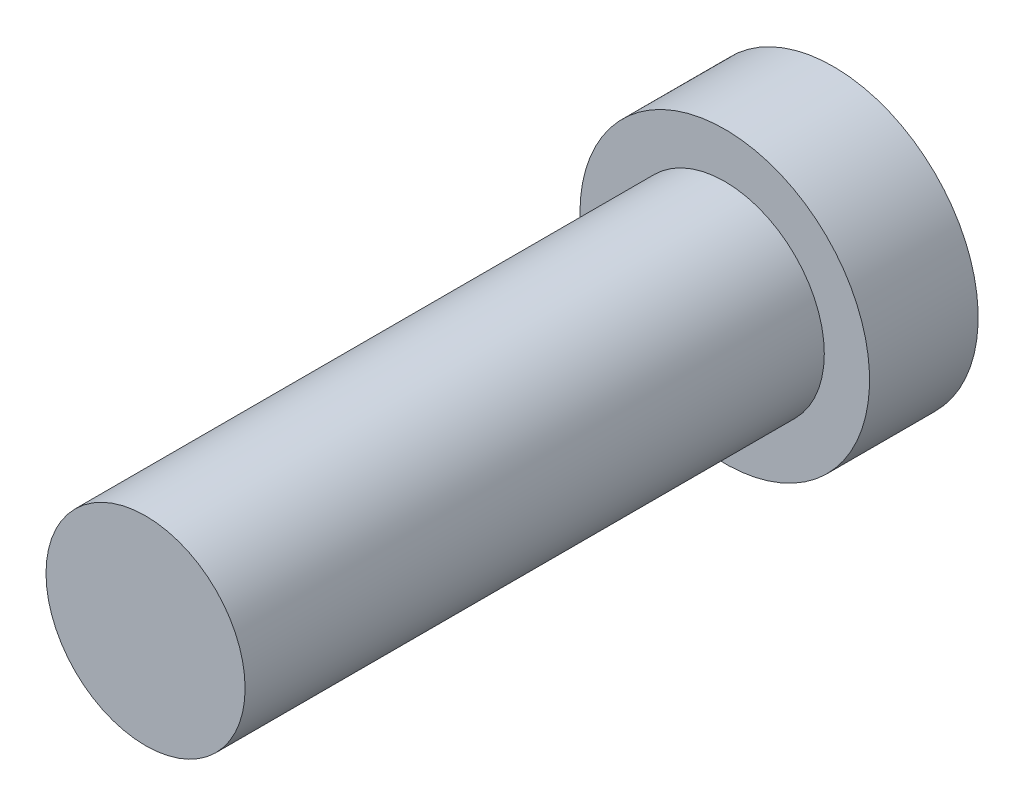
ISO-10303-21;
HEADER;
FILE_DESCRIPTION(('STEP AP214'),'2;1');
FILE_NAME('part.step','',(''),(''),'','','');
FILE_SCHEMA(('AUTOMOTIVE_DESIGN { 1 0 10303 214 1 1 1 1 }'));
ENDSEC;
DATA;
#1=APPLICATION_CONTEXT('core data for automotive mechanical design processes');
#2=APPLICATION_PROTOCOL_DEFINITION('international standard','automotive_design',2000,#1);
#3=PRODUCT_CONTEXT('',#1,'mechanical');
#4=PRODUCT('Part','Part','',(#3));
#5=PRODUCT_RELATED_PRODUCT_CATEGORY('part','',(#4));
#6=PRODUCT_DEFINITION_FORMATION('','',#4);
#7=PRODUCT_DEFINITION_CONTEXT('part definition',#1,'design');
#8=PRODUCT_DEFINITION('design','',#6,#7);
#9=PRODUCT_DEFINITION_SHAPE('','',#8);
#10=(LENGTH_UNIT() NAMED_UNIT(*) SI_UNIT(.MILLI.,.METRE.));
#11=(NAMED_UNIT(*) PLANE_ANGLE_UNIT() SI_UNIT($,.RADIAN.));
#12=(NAMED_UNIT(*) SI_UNIT($,.STERADIAN.) SOLID_ANGLE_UNIT());
#13=UNCERTAINTY_MEASURE_WITH_UNIT(LENGTH_MEASURE(1.E-05),#10,'distance_accuracy_value','');
#14=(GEOMETRIC_REPRESENTATION_CONTEXT(3) GLOBAL_UNCERTAINTY_ASSIGNED_CONTEXT((#13)) GLOBAL_UNIT_ASSIGNED_CONTEXT((#10,
#11,#12)) REPRESENTATION_CONTEXT('',''));
#15=CARTESIAN_POINT('',(0.,0.,0.));
#16=DIRECTION('',(0.,0.,1.));
#17=DIRECTION('',(1.,0.,0.));
#18=AXIS2_PLACEMENT_3D('',#15,#16,#17);
#19=CARTESIAN_POINT('',(0.,0.,8.));
#20=DIRECTION('',(0.,0.,-1.));
#21=DIRECTION('',(-1.,0.,0.));
#22=AXIS2_PLACEMENT_3D('',#19,#20,#21);
#23=CYLINDRICAL_SURFACE('',#22,1.375);
#24=CARTESIAN_POINT('',(0.,0.,8.));
#25=DIRECTION('',(0.,0.,1.));
#26=DIRECTION('',(1.,0.,0.));
#27=AXIS2_PLACEMENT_3D('',#24,#25,#26);
#28=CIRCLE('',#27,1.375);
#29=CARTESIAN_POINT('',(1.375,0.,8.));
#30=VERTEX_POINT('',#29);
#31=EDGE_CURVE('E10',#30,#30,#28,.T.);
#32=ORIENTED_EDGE('',*,*,#31,.F.);
#33=EDGE_LOOP('',(#32));
#34=FACE_BOUND('',#33,.T.);
#35=CARTESIAN_POINT('',(0.,0.,0.));
#36=DIRECTION('',(0.,0.,1.));
#37=DIRECTION('',(1.,0.,0.));
#38=AXIS2_PLACEMENT_3D('',#35,#36,#37);
#39=CIRCLE('',#38,1.375);
#40=CARTESIAN_POINT('',(1.375,0.,0.));
#41=VERTEX_POINT('',#40);
#42=EDGE_CURVE('E40',#41,#41,#39,.T.);
#43=ORIENTED_EDGE('',*,*,#42,.T.);
#44=EDGE_LOOP('',(#43));
#45=FACE_BOUND('',#44,.T.);
#46=ADVANCED_FACE('F37',(#34,#45),#23,.T.);
#47=CARTESIAN_POINT('',(0.,0.,8.));
#48=DIRECTION('',(0.,0.,1.));
#49=DIRECTION('',(1.,0.,0.));
#50=AXIS2_PLACEMENT_3D('',#47,#48,#49);
#51=PLANE('',#50);
#52=ORIENTED_EDGE('',*,*,#31,.T.);
#53=EDGE_LOOP('',(#52));
#54=FACE_BOUND('',#53,.T.);
#55=ADVANCED_FACE('F64',(#54),#51,.T.);
#56=CARTESIAN_POINT('',(0.,0.,-1.5));
#57=DIRECTION('',(0.,0.,1.));
#58=DIRECTION('',(1.,0.,0.));
#59=AXIS2_PLACEMENT_3D('',#56,#57,#58);
#60=CYLINDRICAL_SURFACE('',#59,2.);
#61=CARTESIAN_POINT('',(0.,0.,-1.5));
#62=DIRECTION('',(0.,0.,-1.));
#63=DIRECTION('',(-1.,0.,0.));
#64=AXIS2_PLACEMENT_3D('',#61,#62,#63);
#65=CIRCLE('',#64,2.);
#66=CARTESIAN_POINT('',(-2.,0.,-1.5));
#67=VERTEX_POINT('',#66);
#68=EDGE_CURVE('E49',#67,#67,#65,.T.);
#69=ORIENTED_EDGE('',*,*,#68,.F.);
#70=EDGE_LOOP('',(#69));
#71=FACE_BOUND('',#70,.T.);
#72=CARTESIAN_POINT('',(0.,0.,0.));
#73=DIRECTION('',(0.,0.,-1.));
#74=DIRECTION('',(-1.,0.,0.));
#75=AXIS2_PLACEMENT_3D('',#72,#73,#74);
#76=CIRCLE('',#75,2.);
#77=CARTESIAN_POINT('',(-2.,0.,0.));
#78=VERTEX_POINT('',#77);
#79=EDGE_CURVE('E51',#78,#78,#76,.T.);
#80=ORIENTED_EDGE('',*,*,#79,.T.);
#81=EDGE_LOOP('',(#80));
#82=FACE_BOUND('',#81,.T.);
#83=ADVANCED_FACE('F61',(#71,#82),#60,.T.);
#84=CARTESIAN_POINT('',(0.,0.,-1.5));
#85=DIRECTION('',(0.,0.,-1.));
#86=DIRECTION('',(-1.,0.,0.));
#87=AXIS2_PLACEMENT_3D('',#84,#85,#86);
#88=PLANE('',#87);
#89=ORIENTED_EDGE('',*,*,#68,.T.);
#90=EDGE_LOOP('',(#89));
#91=FACE_BOUND('',#90,.T.);
#92=ADVANCED_FACE('F59',(#91),#88,.T.);
#93=CARTESIAN_POINT('',(0.,0.,0.));
#94=DIRECTION('',(0.,0.,-1.));
#95=DIRECTION('',(-1.,0.,0.));
#96=AXIS2_PLACEMENT_3D('',#93,#94,#95);
#97=PLANE('',#96);
#98=ORIENTED_EDGE('',*,*,#42,.F.);
#99=EDGE_LOOP('',(#98));
#100=FACE_BOUND('',#99,.T.);
#101=ORIENTED_EDGE('',*,*,#79,.F.);
#102=EDGE_LOOP('',(#101));
#103=FACE_BOUND('',#102,.T.);
#104=ADVANCED_FACE('F68',(#100,#103),#97,.F.);
#105=CLOSED_SHELL('',(#46,#55,#83,#92,#104));
#106=MANIFOLD_SOLID_BREP('B2',#105);
#107=ADVANCED_BREP_SHAPE_REPRESENTATION('',(#18,#106),#14);
#108=SHAPE_DEFINITION_REPRESENTATION(#9,#107);
ENDSEC;
END-ISO-10303-21;
